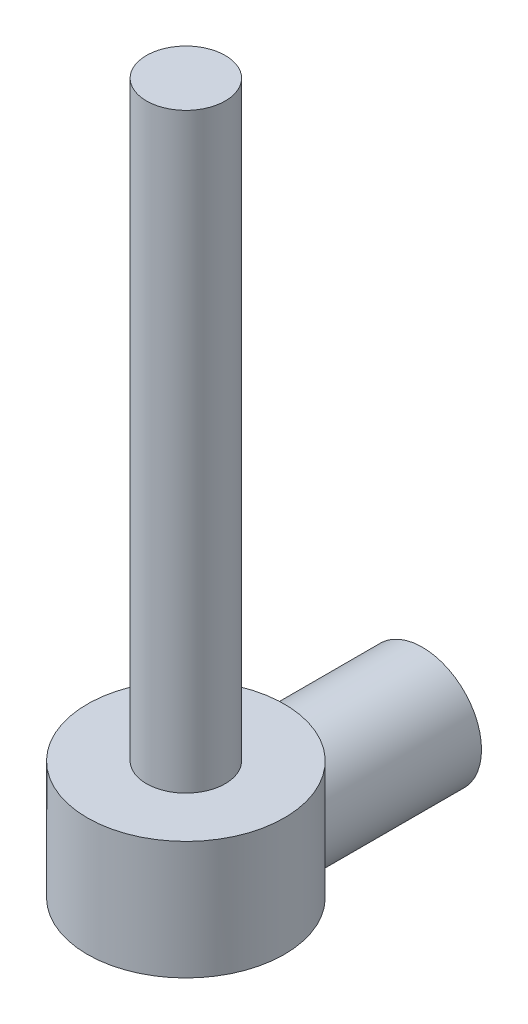
ISO-10303-21;
HEADER;
FILE_DESCRIPTION(('STEP AP214'),'2;1');
FILE_NAME('part.step','',(''),(''),'','','');
FILE_SCHEMA(('AUTOMOTIVE_DESIGN { 1 0 10303 214 1 1 1 1 }'));
ENDSEC;
DATA;
#1=APPLICATION_CONTEXT('core data for automotive mechanical design processes');
#2=APPLICATION_PROTOCOL_DEFINITION('international standard','automotive_design',2000,#1);
#3=PRODUCT_CONTEXT('',#1,'mechanical');
#4=PRODUCT('Part','Part','',(#3));
#5=PRODUCT_RELATED_PRODUCT_CATEGORY('part','',(#4));
#6=PRODUCT_DEFINITION_FORMATION('','',#4);
#7=PRODUCT_DEFINITION_CONTEXT('part definition',#1,'design');
#8=PRODUCT_DEFINITION('design','',#6,#7);
#9=PRODUCT_DEFINITION_SHAPE('','',#8);
#10=(LENGTH_UNIT() NAMED_UNIT(*) SI_UNIT(.MILLI.,.METRE.));
#11=(NAMED_UNIT(*) PLANE_ANGLE_UNIT() SI_UNIT($,.RADIAN.));
#12=(NAMED_UNIT(*) SI_UNIT($,.STERADIAN.) SOLID_ANGLE_UNIT());
#13=UNCERTAINTY_MEASURE_WITH_UNIT(LENGTH_MEASURE(1.E-05),#10,'distance_accuracy_value','');
#14=(GEOMETRIC_REPRESENTATION_CONTEXT(3) GLOBAL_UNCERTAINTY_ASSIGNED_CONTEXT((#13)) GLOBAL_UNIT_ASSIGNED_CONTEXT((#10,
#11,#12)) REPRESENTATION_CONTEXT('',''));
#15=CARTESIAN_POINT('',(0.,0.,0.));
#16=DIRECTION('',(0.,0.,1.));
#17=DIRECTION('',(1.,0.,0.));
#18=AXIS2_PLACEMENT_3D('',#15,#16,#17);
#19=CARTESIAN_POINT('',(0.,0.,-120.));
#20=DIRECTION('',(0.,0.,1.));
#21=DIRECTION('',(1.,0.,0.));
#22=AXIS2_PLACEMENT_3D('',#19,#20,#21);
#23=CYLINDRICAL_SURFACE('',#22,30.);
#24=CARTESIAN_POINT('',(0.,0.,-120.));
#25=DIRECTION('',(0.,0.,1.));
#26=DIRECTION('',(1.,0.,0.));
#27=AXIS2_PLACEMENT_3D('',#24,#25,#26);
#28=CIRCLE('',#27,30.);
#29=CARTESIAN_POINT('',(30.,0.,-120.));
#30=VERTEX_POINT('',#29);
#31=EDGE_CURVE('E77',#30,#30,#28,.T.);
#32=ORIENTED_EDGE('',*,*,#31,.T.);
#33=EDGE_LOOP('',(#32));
#34=FACE_BOUND('',#33,.T.);
#35=CARTESIAN_POINT('',(0.,0.,0.));
#36=DIRECTION('',(0.,0.,1.));
#37=DIRECTION('',(1.,0.,0.));
#38=AXIS2_PLACEMENT_3D('',#35,#36,#37);
#39=CIRCLE('',#38,30.);
#40=CARTESIAN_POINT('',(-22.3606797749979,-20.,0.));
#41=VERTEX_POINT('',#40);
#42=CARTESIAN_POINT('',(22.3606797749979,-20.,0.));
#43=VERTEX_POINT('',#42);
#44=EDGE_CURVE('E80',#41,#43,#39,.T.);
#45=ORIENTED_EDGE('',*,*,#44,.F.);
#46=DIRECTION('',(0.,0.,1.));
#47=VECTOR('',#46,1.);
#48=CARTESIAN_POINT('',(-22.3606797749979,-20.,-120.));
#49=LINE('',#48,#47);
#50=CARTESIAN_POINT('',(-22.3606797749979,-20.,-44.7213595499958));
#51=VERTEX_POINT('',#50);
#52=EDGE_CURVE('E53',#41,#51,#49,.F.);
#53=ORIENTED_EDGE('',*,*,#52,.T.);
#54=CARTESIAN_POINT('',(30.,0.,-40.));
#55=CARTESIAN_POINT('',(30.0000054371733,0.754773079428564,-39.9999924355509));
#56=CARTESIAN_POINT('',(29.9714752342614,1.50948924622845,-40.0214403954393));
#57=CARTESIAN_POINT('',(29.8578998383123,3.01222264616021,-40.1062444493847));
#58=CARTESIAN_POINT('',(29.7728584078095,3.76024032191946,-40.1695977533699));
#59=CARTESIAN_POINT('',(29.5476372030003,5.2441364599569,-40.3355499097489));
#60=CARTESIAN_POINT('',(29.4074070436577,5.98000318745316,-40.438184622088));
#61=CARTESIAN_POINT('',(29.0739716563499,7.43373400086841,-40.6785728662393));
#62=CARTESIAN_POINT('',(28.8807636589501,8.15159714350204,-40.8163282339694));
#63=CARTESIAN_POINT('',(28.445531905068,9.55986424580085,-41.1208174466127));
#64=CARTESIAN_POINT('',(28.2038804459786,10.2504322497716,-41.2873290187728));
#65=CARTESIAN_POINT('',(27.6733374325039,11.6067524308452,-41.644790948041));
#66=CARTESIAN_POINT('',(27.3844396594046,12.2725013269922,-41.8357445215649));
#67=CARTESIAN_POINT('',(26.9175218389558,13.2505717076948,-42.1364605134893));
#68=CARTESIAN_POINT('',(26.756254628249,13.5732271148505,-42.2391003045645));
#69=CARTESIAN_POINT('',(26.4228282782668,14.2113934734989,-42.4484734074239));
#70=CARTESIAN_POINT('',(26.2506719799853,14.5269062595888,-42.5552056486378));
#71=CARTESIAN_POINT('',(25.7181480386,15.4626009873731,-42.8806472634173));
#72=CARTESIAN_POINT('',(25.3417344973462,16.0719201724563,-43.1045955804228));
#73=CARTESIAN_POINT('',(24.4995757857681,17.3324425072035,-43.5893887462092));
#74=CARTESIAN_POINT('',(24.0285354757498,17.9796546133088,-43.8513964328546));
#75=CARTESIAN_POINT('',(23.0373408991427,19.233290460478,-44.3801358051689));
#76=CARTESIAN_POINT('',(22.5171838053726,19.8397118501679,-44.6468677620499));
#77=CARTESIAN_POINT('',(21.4294452953907,21.0099367523766,-45.1790404761606));
#78=CARTESIAN_POINT('',(20.8618305432127,21.573709768574,-45.4444801847927));
#79=CARTESIAN_POINT('',(19.681488615426,22.6556839826832,-45.9679876279243));
#80=CARTESIAN_POINT('',(19.0687591408844,23.1738828552944,-46.2260549858159));
#81=CARTESIAN_POINT('',(17.7316223686081,24.2153507973842,-46.7564021460829));
#82=CARTESIAN_POINT('',(17.0023054886216,24.7330987799033,-47.0271973104288));
#83=CARTESIAN_POINT('',(15.4942685286804,25.7047112154735,-47.5453815754836));
#84=CARTESIAN_POINT('',(14.715543968244,26.158569862743,-47.7927685483637));
#85=CARTESIAN_POINT('',(13.1136665383535,26.9971922251109,-48.2568802958075));
#86=CARTESIAN_POINT('',(12.2905451657093,27.3820041074603,-48.4736264229592));
#87=CARTESIAN_POINT('',(10.6050928823802,28.0777989799473,-48.870041879193));
#88=CARTESIAN_POINT('',(9.74276844298749,28.3887941027499,-49.0497173006521));
#89=CARTESIAN_POINT('',(8.06989441005333,28.9062031952631,-49.3510766635053));
#90=CARTESIAN_POINT('',(7.26225533212927,29.1197644658465,-49.4766580911894));
#91=CARTESIAN_POINT('',(5.62706899055213,29.4794276662173,-49.6891894498777));
#92=CARTESIAN_POINT('',(4.79952288403311,29.6255335070595,-49.7761416205889));
#93=CARTESIAN_POINT('',(3.13246717024252,29.8478515838854,-49.9087796773502));
#94=CARTESIAN_POINT('',(2.29296745458033,29.924118545397,-49.9544978737898));
#95=CARTESIAN_POINT('',(0.609322714269914,30.0056462782551,-50.0033768126454));
#96=CARTESIAN_POINT('',(-0.234821829012517,30.0109142739014,-50.0065418849347));
#97=CARTESIAN_POINT('',(-1.81489529981786,29.95415500019,-49.9725033434349));
#98=CARTESIAN_POINT('',(-2.55124667795299,29.9004022371462,-49.9402633154867));
#99=CARTESIAN_POINT('',(-4.01585794086052,29.739124395353,-49.8438693758083));
#100=CARTESIAN_POINT('',(-4.74411865138387,29.6316048566647,-49.7797187521093));
#101=CARTESIAN_POINT('',(-6.18756243161352,29.3641437085351,-49.620977165127));
#102=CARTESIAN_POINT('',(-6.90274503157525,29.20420022,-49.5263851106974));
#103=CARTESIAN_POINT('',(-8.31547959196037,28.8337670024337,-49.3088598139461));
#104=CARTESIAN_POINT('',(-9.0130308246176,28.6232751906837,-49.1859254038559));
#105=CARTESIAN_POINT('',(-10.3904072750655,28.1526581576168,-48.9135476146462));
#106=CARTESIAN_POINT('',(-11.0701088227145,27.8922569228414,-48.7639571594241));
#107=CARTESIAN_POINT('',(-12.4041910107697,27.3251067169327,-48.441789827711));
#108=CARTESIAN_POINT('',(-13.0585718889383,27.0183581811358,-48.2692131671293));
#109=CARTESIAN_POINT('',(-14.3392870539587,26.3610135406394,-47.9043659781244));
#110=CARTESIAN_POINT('',(-14.9656174396906,26.0104113625566,-47.7120927225473));
#111=CARTESIAN_POINT('',(-16.1878487666349,25.2678641870583,-47.3113861831583));
#112=CARTESIAN_POINT('',(-16.7837477967321,24.8759165978422,-47.1029518864841));
#113=CARTESIAN_POINT('',(-18.0124884902317,24.0038251222862,-46.6479274519125));
#114=CARTESIAN_POINT('',(-18.6412397419404,23.5187386533106,-46.3997536842666));
#115=CARTESIAN_POINT('',(-19.8559772510624,22.502607304962,-45.8930644751573));
#116=CARTESIAN_POINT('',(-20.4419605571017,21.9715592593429,-45.6345483218784));
#117=CARTESIAN_POINT('',(-21.5698875988211,20.8653945949799,-45.1123778800076));
#118=CARTESIAN_POINT('',(-22.1117741531459,20.2902225786288,-44.8487174528413));
#119=CARTESIAN_POINT('',(-23.1487409834838,19.0986815642021,-44.3223864406096));
#120=CARTESIAN_POINT('',(-23.6438190972658,18.4823106652618,-44.0597159018081));
#121=CARTESIAN_POINT('',(-24.6397506704863,17.1365792062999,-43.5114023855333));
#122=CARTESIAN_POINT('',(-25.134607075518,16.4024071704545,-43.2266309181986));
#123=CARTESIAN_POINT('',(-26.060187845091,14.8880542042171,-42.6750161739419));
#124=CARTESIAN_POINT('',(-26.4909016641373,14.107865737769,-42.4081758489753));
#125=CARTESIAN_POINT('',(-27.2835991057643,12.5060980569954,-41.9025771259453));
#126=CARTESIAN_POINT('',(-27.6456857193192,11.6845832451744,-41.663776855557));
#127=CARTESIAN_POINT('',(-28.2973336841537,10.0036296959614,-41.2239700066492));
#128=CARTESIAN_POINT('',(-28.586923525734,9.144206012938,-41.0229485892923));
#129=CARTESIAN_POINT('',(-29.0266922229524,7.61055439517443,-40.7124607158074));
#130=CARTESIAN_POINT('',(-29.1936352760004,6.94318574540926,-40.5926498926779));
#131=CARTESIAN_POINT('',(-29.4819157838905,5.59394741557896,-40.3837646228614));
#132=CARTESIAN_POINT('',(-29.6032605207762,4.91208006934632,-40.2946852685501));
#133=CARTESIAN_POINT('',(-29.7986252970483,3.53871644845567,-40.1504262123343));
#134=CARTESIAN_POINT('',(-29.8726922198134,2.847230409919,-40.0952129290315));
#135=CARTESIAN_POINT('',(-29.9725913229736,1.45881623193731,-40.0205909917451));
#136=CARTESIAN_POINT('',(-29.9984224804208,0.76188797739261,-40.0011830970955));
#137=CARTESIAN_POINT('',(-30.001439292512,-0.633092969562076,-39.9989205730711));
#138=CARTESIAN_POINT('',(-29.9785579814936,-1.33114588996815,-40.016116263115));
#139=CARTESIAN_POINT('',(-29.8843768935634,-2.72212786656804,-40.0864993514701));
#140=CARTESIAN_POINT('',(-29.8130768644567,-3.41505689605444,-40.1396869372494));
#141=CARTESIAN_POINT('',(-29.6230684849219,-4.7913202770706,-40.2801155116223));
#142=CARTESIAN_POINT('',(-29.5043282866804,-5.47464786325118,-40.3673793756118));
#143=CARTESIAN_POINT('',(-29.2210546703214,-6.82695351863887,-40.5729035284754));
#144=CARTESIAN_POINT('',(-29.0565199657639,-7.49593118416539,-40.6911646881071));
#145=CARTESIAN_POINT('',(-28.6838971255832,-8.81493130388343,-40.9546817127304));
#146=CARTESIAN_POINT('',(-28.4758792783311,-9.46498244311764,-41.099893970628));
#147=CARTESIAN_POINT('',(-28.0180764187168,-10.7447421919885,-41.4133350881076));
#148=CARTESIAN_POINT('',(-27.7682746224651,-11.3744425052817,-41.5815731918176));
#149=CARTESIAN_POINT('',(-27.2288911048792,-12.6112149171688,-41.9367586997092));
#150=CARTESIAN_POINT('',(-26.9393018498846,-13.2182827026054,-42.1237096452986));
#151=CARTESIAN_POINT('',(-26.3223000055147,-14.4078239321894,-42.5119906697039));
#152=CARTESIAN_POINT('',(-25.9948971032765,-14.9903036233565,-42.713317060781));
#153=CARTESIAN_POINT('',(-25.2414085206861,-16.2323716245478,-43.1636078905243));
#154=CARTESIAN_POINT('',(-24.8081780488878,-16.8868967379914,-43.4146109863377));
#155=CARTESIAN_POINT('',(-23.8934940052003,-18.1580335537829,-43.9246536038002));
#156=CARTESIAN_POINT('',(-23.4120360691993,-18.7746418168658,-44.1836938512659));
#157=CARTESIAN_POINT('',(-22.4025038732756,-19.9684598947072,-44.7040326920285));
#158=CARTESIAN_POINT('',(-21.8743891519663,-20.5456347277241,-44.9653330646558));
#159=CARTESIAN_POINT('',(-20.7737943393439,-21.6578301169655,-45.4842796758364));
#160=CARTESIAN_POINT('',(-20.2013119528565,-22.1928484895119,-45.7419257245319));
#161=CARTESIAN_POINT('',(-18.9364779766342,-23.2851001855273,-46.2811171660542));
#162=CARTESIAN_POINT('',(-18.2382257014387,-23.8361500707667,-46.5614043507672));
#163=CARTESIAN_POINT('',(-16.7904682073809,-24.8772013130106,-47.1028396436449));
#164=CARTESIAN_POINT('',(-16.0409577545394,-25.367196421245,-47.3639857916585));
#165=CARTESIAN_POINT('',(-14.4948690885771,-26.281262214501,-47.8597679650153));
#166=CARTESIAN_POINT('',(-13.6983136253921,-26.7053644094267,-48.0944166466547));
#167=CARTESIAN_POINT('',(-12.0627242110709,-27.4829085808844,-48.5304710877414));
#168=CARTESIAN_POINT('',(-11.2236960707639,-27.8363601907911,-48.731881378668));
#169=CARTESIAN_POINT('',(-9.57163089673216,-28.4447091895007,-49.0820154369011));
#170=CARTESIAN_POINT('',(-8.76112996669412,-28.7048990218314,-49.2335028420043));
#171=CARTESIAN_POINT('',(-7.11503534150896,-29.1565507968783,-49.4981910314828));
#172=CARTESIAN_POINT('',(-6.2794425810149,-29.3480152961319,-49.6113932400335));
#173=CARTESIAN_POINT('',(-4.59121918613497,-29.6590072808807,-49.7959943798632));
#174=CARTESIAN_POINT('',(-3.73860538410503,-29.7786025195841,-49.8674326814406));
#175=CARTESIAN_POINT('',(-2.02375863082272,-29.9440494730322,-49.9664050743555));
#176=CARTESIAN_POINT('',(-1.16152694827897,-29.989910800952,-49.9939448890237));
#177=CARTESIAN_POINT('',(0.448638369596445,-30.0059636845279,-50.0035796163062));
#178=CARTESIAN_POINT('',(1.19646649879258,-29.9854383726646,-49.9912497430118));
#179=CARTESIAN_POINT('',(2.68715701856053,-29.8887419424398,-49.9333091422452));
#180=CARTESIAN_POINT('',(3.43001993824538,-29.8125768518574,-49.8877020198906));
#181=CARTESIAN_POINT('',(4.90534527411018,-29.6056163790939,-49.7643009048837));
#182=CARTESIAN_POINT('',(5.63780776281641,-29.4748213780622,-49.6865071367958));
#183=CARTESIAN_POINT('',(7.08732236988181,-29.160245460038,-49.5005437474305));
#184=CARTESIAN_POINT('',(7.80437402569055,-28.9764629550249,-49.3923732157727));
#185=CARTESIAN_POINT('',(9.20713596965785,-28.5614260115334,-49.1500473875609));
#186=CARTESIAN_POINT('',(9.89316522831644,-28.3309850756384,-49.0163393490528));
#187=CARTESIAN_POINT('',(11.242249514208,-27.8232155122072,-48.7246154429874));
#188=CARTESIAN_POINT('',(11.9053051081935,-27.5458880423398,-48.5666001756052));
#189=CARTESIAN_POINT('',(13.2054545723106,-26.946769704929,-48.2293178600434));
#190=CARTESIAN_POINT('',(13.8425455868989,-26.6249739638318,-48.0500484828003));
#191=CARTESIAN_POINT('',(15.0881846024373,-25.9393946780803,-47.6735789595605));
#192=CARTESIAN_POINT('',(15.6967308045441,-25.5756084922492,-47.4763776858225));
#193=CARTESIAN_POINT('',(16.9476190424841,-24.7667424868672,-47.0453184951055));
#194=CARTESIAN_POINT('',(17.5864585689585,-24.317124761882,-46.8098051726833));
#195=CARTESIAN_POINT('',(18.8241654588664,-23.3721450786188,-46.325936934833));
#196=CARTESIAN_POINT('',(19.4230304625739,-22.876780423972,-46.0775812628444));
#197=CARTESIAN_POINT('',(20.5793876993337,-21.8424161446594,-45.5728772295248));
#198=CARTESIAN_POINT('',(21.1368376378641,-21.3033730570058,-45.3165210670254));
#199=CARTESIAN_POINT('',(22.2078589213948,-20.1844237054672,-44.8013865884645));
#200=CARTESIAN_POINT('',(22.7214277151681,-19.6045150692523,-44.5426081325414));
#201=CARTESIAN_POINT('',(23.7652386100365,-18.329631573187,-43.9954895932492));
#202=CARTESIAN_POINT('',(24.2893195038196,-17.6293953373685,-43.7075675480209));
#203=CARTESIAN_POINT('',(25.0295083694434,-16.5443485377289,-43.2851540783708));
#204=CARTESIAN_POINT('',(25.2686007562634,-16.1768518277079,-43.1459165421275));
#205=CARTESIAN_POINT('',(25.731195664513,-15.4304379178484,-42.8716442524079));
#206=CARTESIAN_POINT('',(25.9546924020116,-15.0515165547962,-42.7366110683665));
#207=CARTESIAN_POINT('',(26.6007590168042,-13.8987545541486,-42.3397557549876));
#208=CARTESIAN_POINT('',(26.999246247833,-13.1084169941735,-42.0859808338299));
#209=CARTESIAN_POINT('',(27.7276182166738,-11.4877271374779,-41.6097198076573));
#210=CARTESIAN_POINT('',(28.0575206168377,-10.6573852109228,-41.3872256518336));
#211=CARTESIAN_POINT('',(28.4850286249539,-9.4218729808165,-41.0929389990196));
#212=CARTESIAN_POINT('',(28.6115719641199,-9.03038758470866,-41.0048657325039));
#213=CARTESIAN_POINT('',(28.8489055913011,-8.24078837678755,-40.8382373313778));
#214=CARTESIAN_POINT('',(28.9596998522838,-7.84267626508385,-40.7596797970073));
#215=CARTESIAN_POINT('',(29.2678307379545,-6.63922693192674,-40.5395886546573));
#216=CARTESIAN_POINT('',(29.440976404297,-5.82460119453232,-40.4135940279387));
#217=CARTESIAN_POINT('',(29.7191257226127,-4.17951386891395,-40.209493955114));
#218=CARTESIAN_POINT('',(29.8242560556143,-3.34908470349394,-40.1312994945307));
#219=CARTESIAN_POINT('',(29.9646857763522,-1.67907944636471,-40.0265599738779));
#220=CARTESIAN_POINT('',(29.9999939524452,-0.839504519189612,-40.0000084136404));
#221=CARTESIAN_POINT('',(30.,0.,-40.));
#222=B_SPLINE_CURVE_WITH_KNOTS('',3,(#54,#55,#56,#57,#58,#59,#60,#61,#62,#63,#64,#65,#66,#67,
#68,#69,#70,#71,#72,#73,#74,#75,#76,#77,#78,#79,#80,#81,#82,#83,#84,#85,#86,#87,#88,#89,#90,#91,
#92,#93,#94,#95,#96,#97,#98,#99,#100,#101,#102,#103,#104,#105,#106,#107,#108,#109,#110,#111,
#112,#113,#114,#115,#116,#117,#118,#119,#120,#121,#122,#123,#124,#125,#126,#127,#128,#129,#130,
#131,#132,#133,#134,#135,#136,#137,#138,#139,#140,#141,#142,#143,#144,#145,#146,#147,#148,#149,
#150,#151,#152,#153,#154,#155,#156,#157,#158,#159,#160,#161,#162,#163,#164,#165,#166,#167,#168,
#169,#170,#171,#172,#173,#174,#175,#176,#177,#178,#179,#180,#181,#182,#183,#184,#185,#186,#187,
#188,#189,#190,#191,#192,#193,#194,#195,#196,#197,#198,#199,#200,#201,#202,#203,#204,#205,#206,
#207,#208,#209,#210,#211,#212,#213,#214,#215,#216,#217,#218,#219,#220,#221),.UNSPECIFIED.,.T.,
.F.,(4,2,2,2,2,2,2,2,2,2,2,2,2,2,2,2,2,2,2,2,2,2,2,2,2,2,2,2,2,2,2,2,2,2,2,2,2,2,2,2,2,2,2,2,2,
2,2,2,2,2,2,2,2,2,2,2,2,2,2,2,2,2,2,2,2,2,2,2,2,2,2,2,2,2,2,2,2,2,2,2,2,2,2,4),(0.,
2.26339065976523,4.52663063739906,6.79194167103308,9.05737114715353,11.3060153718576,
13.5549558090047,14.6798398054329,15.8044315174353,18.053680844433,20.578006829107,
23.1024782036475,25.6287380005962,28.1551266186055,30.954941350871,33.7550103451903,
36.553118342749,39.3507661189212,41.8814765390891,44.4120402106454,46.9406192393127,
49.4689409776018,51.683333411791,53.8974977247652,56.1117414113421,58.3260763460167,
60.5530302662239,62.7799632701391,65.0072050288865,67.2345864887666,69.7280443332067,
72.2216740863463,74.71848750613,77.2154162053875,80.002108172649,82.7892577871951,
85.5721909336379,88.3540287001651,90.4467811706651,92.5391992867497,94.6295392047497,
96.7199234526042,98.8131832342802,100.906453919041,103.001132238211,105.095869406138,
107.187246361405,109.279465412906,111.372081168463,113.46416201983,115.933925800171,
118.403913272112,120.876064180349,123.348343060374,126.142642921312,128.937228535818,
131.730473642596,134.523337623591,137.113418055671,139.703402128459,142.290940703078,
144.878141895905,147.120010063233,149.361635392023,151.603245081396,153.844921958156,
156.050442084091,158.25590776179,160.461615342147,162.667461736035,165.112763633141,
167.558209750834,170.006119860739,172.454172194157,175.21302745175,176.592687183034,
177.972855896356,180.731292892543,183.489018638118,184.750877047949,186.012416565873,
188.534926127152,191.052723792891,193.57020452896),.UNSPECIFIED.);
#223=CARTESIAN_POINT('',(22.3606797749979,-20.,-44.7213595499958));
#224=VERTEX_POINT('',#223);
#225=EDGE_CURVE('E37',#224,#51,#222,.T.);
#226=ORIENTED_EDGE('',*,*,#225,.F.);
#227=DIRECTION('',(0.,0.,1.));
#228=VECTOR('',#227,1.);
#229=CARTESIAN_POINT('',(22.3606797749979,-20.,-120.));
#230=LINE('',#229,#228);
#231=EDGE_CURVE('E63',#224,#43,#230,.T.);
#232=ORIENTED_EDGE('',*,*,#231,.T.);
#233=EDGE_LOOP('',(#45,#53,#226,#232));
#234=FACE_BOUND('',#233,.T.);
#235=ADVANCED_FACE('F33',(#34,#234),#23,.T.);
#236=CARTESIAN_POINT('',(0.,0.,0.));
#237=DIRECTION('',(0.,0.,1.));
#238=DIRECTION('',(1.,0.,0.));
#239=AXIS2_PLACEMENT_3D('',#236,#237,#238);
#240=PLANE('',#239);
#241=ORIENTED_EDGE('',*,*,#44,.T.);
#242=DIRECTION('',(-1.,0.,0.));
#243=VECTOR('',#242,1.);
#244=CARTESIAN_POINT('',(0.,-20.,0.));
#245=LINE('',#244,#243);
#246=EDGE_CURVE('E57',#43,#41,#245,.T.);
#247=ORIENTED_EDGE('',*,*,#246,.T.);
#248=EDGE_LOOP('',(#241,#247));
#249=FACE_BOUND('',#248,.T.);
#250=ADVANCED_FACE('F111',(#249),#240,.T.);
#251=CARTESIAN_POINT('',(0.,0.,-120.));
#252=DIRECTION('',(0.,0.,1.));
#253=DIRECTION('',(1.,0.,0.));
#254=AXIS2_PLACEMENT_3D('',#251,#252,#253);
#255=PLANE('',#254);
#256=ORIENTED_EDGE('',*,*,#31,.F.);
#257=EDGE_LOOP('',(#256));
#258=FACE_BOUND('',#257,.T.);
#259=ADVANCED_FACE('F105',(#258),#255,.F.);
#260=CARTESIAN_POINT('',(0.,-20.,0.));
#261=DIRECTION('',(0.,1.,0.));
#262=DIRECTION('',(0.,0.,1.));
#263=AXIS2_PLACEMENT_3D('',#260,#261,#262);
#264=CYLINDRICAL_SURFACE('',#263,50.);
#265=CARTESIAN_POINT('',(0.,-20.,0.));
#266=DIRECTION('',(0.,1.,0.));
#267=DIRECTION('',(0.,0.,1.));
#268=AXIS2_PLACEMENT_3D('',#265,#266,#267);
#269=CIRCLE('',#268,50.);
#270=EDGE_CURVE('E66',#51,#224,#269,.T.);
#271=ORIENTED_EDGE('',*,*,#270,.T.);
#272=ORIENTED_EDGE('',*,*,#225,.T.);
#273=EDGE_LOOP('',(#271,#272));
#274=FACE_BOUND('',#273,.T.);
#275=CARTESIAN_POINT('',(0.,40.,0.));
#276=DIRECTION('',(0.,1.,0.));
#277=DIRECTION('',(0.,0.,1.));
#278=AXIS2_PLACEMENT_3D('',#275,#276,#277);
#279=CIRCLE('',#278,50.);
#280=CARTESIAN_POINT('',(0.,40.,50.));
#281=VERTEX_POINT('',#280);
#282=EDGE_CURVE('E75',#281,#281,#279,.T.);
#283=ORIENTED_EDGE('',*,*,#282,.F.);
#284=EDGE_LOOP('',(#283));
#285=FACE_BOUND('',#284,.T.);
#286=ADVANCED_FACE('F73',(#274,#285),#264,.T.);
#287=CARTESIAN_POINT('',(0.,-20.,0.));
#288=DIRECTION('',(0.,1.,0.));
#289=DIRECTION('',(0.,0.,1.));
#290=AXIS2_PLACEMENT_3D('',#287,#288,#289);
#291=PLANE('',#290);
#292=ORIENTED_EDGE('',*,*,#52,.F.);
#293=ORIENTED_EDGE('',*,*,#246,.F.);
#294=ORIENTED_EDGE('',*,*,#231,.F.);
#295=ORIENTED_EDGE('',*,*,#270,.F.);
#296=EDGE_LOOP('',(#292,#293,#294,#295));
#297=FACE_BOUND('',#296,.T.);
#298=ADVANCED_FACE('F65',(#297),#291,.F.);
#299=CARTESIAN_POINT('',(0.,40.,0.));
#300=DIRECTION('',(0.,1.,0.));
#301=DIRECTION('',(0.,0.,1.));
#302=AXIS2_PLACEMENT_3D('',#299,#300,#301);
#303=PLANE('',#302);
#304=CARTESIAN_POINT('',(0.,40.,0.));
#305=DIRECTION('',(0.,1.,0.));
#306=DIRECTION('',(0.,0.,1.));
#307=AXIS2_PLACEMENT_3D('',#304,#305,#306);
#308=CIRCLE('',#307,20.);
#309=CARTESIAN_POINT('',(0.,40.,20.));
#310=VERTEX_POINT('',#309);
#311=EDGE_CURVE('E11',#310,#310,#308,.T.);
#312=ORIENTED_EDGE('',*,*,#311,.F.);
#313=EDGE_LOOP('',(#312));
#314=FACE_BOUND('',#313,.T.);
#315=ORIENTED_EDGE('',*,*,#282,.T.);
#316=EDGE_LOOP('',(#315));
#317=FACE_BOUND('',#316,.T.);
#318=ADVANCED_FACE('F96',(#314,#317),#303,.T.);
#319=CARTESIAN_POINT('',(0.,340.,0.));
#320=DIRECTION('',(0.,-1.,0.));
#321=DIRECTION('',(0.,0.,-1.));
#322=AXIS2_PLACEMENT_3D('',#319,#320,#321);
#323=CYLINDRICAL_SURFACE('',#322,20.);
#324=CARTESIAN_POINT('',(0.,340.,0.));
#325=DIRECTION('',(0.,1.,0.));
#326=DIRECTION('',(0.,0.,1.));
#327=AXIS2_PLACEMENT_3D('',#324,#325,#326);
#328=CIRCLE('',#327,20.);
#329=CARTESIAN_POINT('',(0.,340.,20.));
#330=VERTEX_POINT('',#329);
#331=EDGE_CURVE('E86',#330,#330,#328,.T.);
#332=ORIENTED_EDGE('',*,*,#331,.F.);
#333=EDGE_LOOP('',(#332));
#334=FACE_BOUND('',#333,.T.);
#335=ORIENTED_EDGE('',*,*,#311,.T.);
#336=EDGE_LOOP('',(#335));
#337=FACE_BOUND('',#336,.T.);
#338=ADVANCED_FACE('F93',(#334,#337),#323,.T.);
#339=CARTESIAN_POINT('',(0.,340.,0.));
#340=DIRECTION('',(0.,1.,0.));
#341=DIRECTION('',(0.,0.,1.));
#342=AXIS2_PLACEMENT_3D('',#339,#340,#341);
#343=PLANE('',#342);
#344=ORIENTED_EDGE('',*,*,#331,.T.);
#345=EDGE_LOOP('',(#344));
#346=FACE_BOUND('',#345,.T.);
#347=ADVANCED_FACE('F91',(#346),#343,.T.);
#348=CLOSED_SHELL('',(#235,#250,#259,#286,#298,#318,#338,#347));
#349=MANIFOLD_SOLID_BREP('B2',#348);
#350=ADVANCED_BREP_SHAPE_REPRESENTATION('',(#18,#349),#14);
#351=SHAPE_DEFINITION_REPRESENTATION(#9,#350);
ENDSEC;
END-ISO-10303-21;
